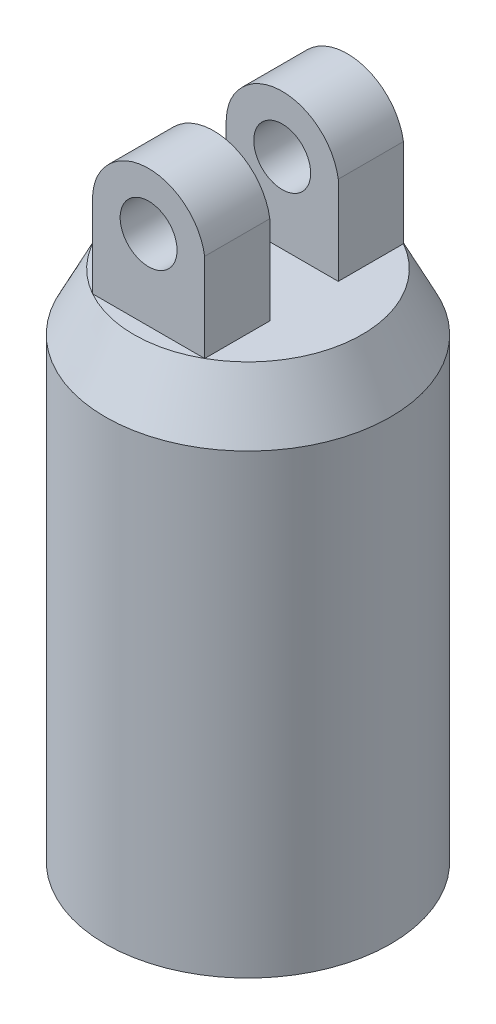
ISO-10303-21;
HEADER;
FILE_DESCRIPTION(('STEP AP214'),'2;1');
FILE_NAME('part.step','',(''),(''),'','','');
FILE_SCHEMA(('AUTOMOTIVE_DESIGN { 1 0 10303 214 1 1 1 1 }'));
ENDSEC;
DATA;
#1=APPLICATION_CONTEXT('core data for automotive mechanical design processes');
#2=APPLICATION_PROTOCOL_DEFINITION('international standard','automotive_design',2000,#1);
#3=PRODUCT_CONTEXT('',#1,'mechanical');
#4=PRODUCT('Part','Part','',(#3));
#5=PRODUCT_RELATED_PRODUCT_CATEGORY('part','',(#4));
#6=PRODUCT_DEFINITION_FORMATION('','',#4);
#7=PRODUCT_DEFINITION_CONTEXT('part definition',#1,'design');
#8=PRODUCT_DEFINITION('design','',#6,#7);
#9=PRODUCT_DEFINITION_SHAPE('','',#8);
#10=(LENGTH_UNIT() NAMED_UNIT(*) SI_UNIT(.MILLI.,.METRE.));
#11=(NAMED_UNIT(*) PLANE_ANGLE_UNIT() SI_UNIT($,.RADIAN.));
#12=(NAMED_UNIT(*) SI_UNIT($,.STERADIAN.) SOLID_ANGLE_UNIT());
#13=UNCERTAINTY_MEASURE_WITH_UNIT(LENGTH_MEASURE(1.E-05),#10,'distance_accuracy_value','');
#14=(GEOMETRIC_REPRESENTATION_CONTEXT(3) GLOBAL_UNCERTAINTY_ASSIGNED_CONTEXT((#13)) GLOBAL_UNIT_ASSIGNED_CONTEXT((#10,
#11,#12)) REPRESENTATION_CONTEXT('',''));
#15=CARTESIAN_POINT('',(0.,0.,0.));
#16=DIRECTION('',(0.,0.,1.));
#17=DIRECTION('',(1.,0.,0.));
#18=AXIS2_PLACEMENT_3D('',#15,#16,#17);
#19=CARTESIAN_POINT('',(4.91424576506021,60.,0.));
#20=DIRECTION('',(1.,0.,0.));
#21=DIRECTION('',(0.,0.,-1.));
#22=AXIS2_PLACEMENT_3D('',#19,#20,#21);
#23=PLANE('',#22);
#24=DIRECTION('',(0.,-1.,0.));
#25=VECTOR('',#24,1.);
#26=CARTESIAN_POINT('',(4.91424576506021,45.,3.));
#27=LINE('',#26,#25);
#28=CARTESIAN_POINT('',(4.91424576506021,52.7583297122865,3.));
#29=VERTEX_POINT('',#28);
#30=CARTESIAN_POINT('',(4.91424576506021,45.,3.));
#31=VERTEX_POINT('',#30);
#32=EDGE_CURVE('E125',#29,#31,#27,.T.);
#33=ORIENTED_EDGE('',*,*,#32,.F.);
#34=DIRECTION('',(0.,0.,1.));
#35=VECTOR('',#34,1.);
#36=CARTESIAN_POINT('',(4.91424576506021,52.7583297122865,-12.5));
#37=LINE('',#36,#35);
#38=CARTESIAN_POINT('',(4.91424576506021,52.7583297122865,8.7092013732941));
#39=VERTEX_POINT('',#38);
#40=EDGE_CURVE('E209',#29,#39,#37,.T.);
#41=ORIENTED_EDGE('',*,*,#40,.T.);
#42=DIRECTION('',(0.,-1.,0.));
#43=VECTOR('',#42,1.);
#44=CARTESIAN_POINT('',(4.91424576506021,60.,8.7092013732941));
#45=LINE('',#44,#43);
#46=CARTESIAN_POINT('',(4.91424576506021,45.,8.7092013732941));
#47=VERTEX_POINT('',#46);
#48=EDGE_CURVE('E154',#39,#47,#45,.T.);
#49=ORIENTED_EDGE('',*,*,#48,.T.);
#50=DIRECTION('',(0.,0.,1.));
#51=VECTOR('',#50,1.);
#52=CARTESIAN_POINT('',(4.91424576506021,45.,0.));
#53=LINE('',#52,#51);
#54=EDGE_CURVE('E141',#31,#47,#53,.T.);
#55=ORIENTED_EDGE('',*,*,#54,.F.);
#56=EDGE_LOOP('',(#33,#41,#49,#55));
#57=FACE_BOUND('',#56,.T.);
#58=ADVANCED_FACE('F37',(#57),#23,.T.);
#59=CARTESIAN_POINT('',(0.,52.1462305767102,-12.5));
#60=DIRECTION('',(0.,0.,1.));
#61=DIRECTION('',(1.,0.,0.));
#62=AXIS2_PLACEMENT_3D('',#59,#60,#61);
#63=CYLINDRICAL_SURFACE('',#62,4.91424576506021);
#64=CARTESIAN_POINT('',(0.,52.1462305767102,3.));
#65=DIRECTION('',(0.,0.,1.));
#66=DIRECTION('',(0.,-1.,0.));
#67=AXIS2_PLACEMENT_3D('',#64,#65,#66);
#68=CIRCLE('',#67,4.91424576506021);
#69=CARTESIAN_POINT('',(-4.91424576506021,52.1462305767102,3.));
#70=VERTEX_POINT('',#69);
#71=CARTESIAN_POINT('',(-4.53494149164419,54.0394070362026,3.));
#72=VERTEX_POINT('',#71);
#73=EDGE_CURVE('E219',#70,#72,#68,.F.);
#74=ORIENTED_EDGE('',*,*,#73,.F.);
#75=DIRECTION('',(0.,0.,1.));
#76=VECTOR('',#75,1.);
#77=CARTESIAN_POINT('',(-4.91424576506021,52.1462305767102,-12.5));
#78=LINE('',#77,#76);
#79=CARTESIAN_POINT('',(-4.91424576506021,52.1462305767102,8.7092013732941));
#80=VERTEX_POINT('',#79);
#81=EDGE_CURVE('E203',#70,#80,#78,.T.);
#82=ORIENTED_EDGE('',*,*,#81,.T.);
#83=CARTESIAN_POINT('',(0.,52.1462305767102,8.7092013732941));
#84=DIRECTION('',(0.,0.,1.));
#85=DIRECTION('',(1.,0.,0.));
#86=AXIS2_PLACEMENT_3D('',#83,#84,#85);
#87=CIRCLE('',#86,4.91424576506021);
#88=CARTESIAN_POINT('',(-4.53494149164419,54.0394070362026,8.7092013732941));
#89=VERTEX_POINT('',#88);
#90=EDGE_CURVE('E194',#89,#80,#87,.T.);
#91=ORIENTED_EDGE('',*,*,#90,.F.);
#92=DIRECTION('',(0.,0.,1.));
#93=VECTOR('',#92,1.);
#94=CARTESIAN_POINT('',(-4.53494149164419,54.0394070362026,-1.89539931335295));
#95=LINE('',#94,#93);
#96=EDGE_CURVE('E180',#89,#72,#95,.F.);
#97=ORIENTED_EDGE('',*,*,#96,.T.);
#98=EDGE_LOOP('',(#74,#82,#91,#97));
#99=FACE_BOUND('',#98,.T.);
#100=ADVANCED_FACE('F267',(#99),#63,.T.);
#101=CARTESIAN_POINT('',(-4.91424576506021,60.,0.));
#102=DIRECTION('',(1.,0.,0.));
#103=DIRECTION('',(0.,0.,-1.));
#104=AXIS2_PLACEMENT_3D('',#101,#102,#103);
#105=PLANE('',#104);
#106=ORIENTED_EDGE('',*,*,#81,.F.);
#107=DIRECTION('',(0.,-1.,0.));
#108=VECTOR('',#107,1.);
#109=CARTESIAN_POINT('',(-4.91424576506021,60.,3.));
#110=LINE('',#109,#108);
#111=CARTESIAN_POINT('',(-4.91424576506021,45.,3.));
#112=VERTEX_POINT('',#111);
#113=EDGE_CURVE('E216',#70,#112,#110,.T.);
#114=ORIENTED_EDGE('',*,*,#113,.T.);
#115=DIRECTION('',(0.,0.,1.));
#116=VECTOR('',#115,1.);
#117=CARTESIAN_POINT('',(-4.91424576506021,45.,0.));
#118=LINE('',#117,#116);
#119=CARTESIAN_POINT('',(-4.91424576506021,45.,8.7092013732941));
#120=VERTEX_POINT('',#119);
#121=EDGE_CURVE('E143',#112,#120,#118,.T.);
#122=ORIENTED_EDGE('',*,*,#121,.T.);
#123=DIRECTION('',(0.,-1.,0.));
#124=VECTOR('',#123,1.);
#125=CARTESIAN_POINT('',(-4.91424576506021,60.,8.7092013732941));
#126=LINE('',#125,#124);
#127=EDGE_CURVE('E157',#80,#120,#126,.T.);
#128=ORIENTED_EDGE('',*,*,#127,.F.);
#129=EDGE_LOOP('',(#106,#114,#122,#128));
#130=FACE_BOUND('',#129,.T.);
#131=ADVANCED_FACE('F243',(#130),#105,.F.);
#132=CARTESIAN_POINT('',(0.,52.,-12.5));
#133=DIRECTION('',(0.,0.,1.));
#134=DIRECTION('',(1.,0.,0.));
#135=AXIS2_PLACEMENT_3D('',#132,#133,#134);
#136=CYLINDRICAL_SURFACE('',#135,2.49298673079241);
#137=CARTESIAN_POINT('',(0.,52.,3.));
#138=DIRECTION('',(0.,0.,1.));
#139=DIRECTION('',(0.,-1.,0.));
#140=AXIS2_PLACEMENT_3D('',#137,#138,#139);
#141=CIRCLE('',#140,2.49298673079241);
#142=CARTESIAN_POINT('',(0.,49.5070132692076,3.));
#143=VERTEX_POINT('',#142);
#144=EDGE_CURVE('E213',#143,#143,#141,.F.);
#145=ORIENTED_EDGE('',*,*,#144,.T.);
#146=EDGE_LOOP('',(#145));
#147=FACE_BOUND('',#146,.T.);
#148=CARTESIAN_POINT('',(0.,52.,8.7092013732941));
#149=DIRECTION('',(0.,0.,1.));
#150=DIRECTION('',(1.,0.,0.));
#151=AXIS2_PLACEMENT_3D('',#148,#149,#150);
#152=CIRCLE('',#151,2.49298673079241);
#153=CARTESIAN_POINT('',(2.49298673079241,52.,8.7092013732941));
#154=VERTEX_POINT('',#153);
#155=EDGE_CURVE('E200',#154,#154,#152,.T.);
#156=ORIENTED_EDGE('',*,*,#155,.T.);
#157=EDGE_LOOP('',(#156));
#158=FACE_BOUND('',#157,.T.);
#159=ADVANCED_FACE('F271',(#147,#158),#136,.F.);
#160=CARTESIAN_POINT('',(0.,52.,-12.5));
#161=DIRECTION('',(0.,0.,1.));
#162=DIRECTION('',(1.,0.,0.));
#163=AXIS2_PLACEMENT_3D('',#160,#161,#162);
#164=CYLINDRICAL_SURFACE('',#163,4.97241142625474);
#165=CARTESIAN_POINT('',(0.,52.,3.));
#166=DIRECTION('',(0.,0.,1.));
#167=DIRECTION('',(0.,-1.,0.));
#168=AXIS2_PLACEMENT_3D('',#165,#166,#167);
#169=CIRCLE('',#168,4.97241142625474);
#170=EDGE_CURVE('E11',#72,#29,#169,.F.);
#171=ORIENTED_EDGE('',*,*,#170,.F.);
#172=ORIENTED_EDGE('',*,*,#96,.F.);
#173=CARTESIAN_POINT('',(0.,52.,8.7092013732941));
#174=DIRECTION('',(0.,0.,1.));
#175=DIRECTION('',(1.,0.,0.));
#176=AXIS2_PLACEMENT_3D('',#173,#174,#175);
#177=CIRCLE('',#176,4.97241142625474);
#178=EDGE_CURVE('E210',#39,#89,#177,.T.);
#179=ORIENTED_EDGE('',*,*,#178,.F.);
#180=ORIENTED_EDGE('',*,*,#40,.F.);
#181=EDGE_LOOP('',(#171,#172,#179,#180));
#182=FACE_BOUND('',#181,.T.);
#183=ADVANCED_FACE('F286',(#182),#164,.T.);
#184=CARTESIAN_POINT('',(0.,60.,-8.7092013732941));
#185=DIRECTION('',(0.,0.,-1.));
#186=DIRECTION('',(0.,1.,0.));
#187=AXIS2_PLACEMENT_3D('',#184,#185,#186);
#188=PLANE('',#187);
#189=CARTESIAN_POINT('',(0.,52.,-8.7092013732941));
#190=DIRECTION('',(0.,0.,-1.));
#191=DIRECTION('',(0.,1.,0.));
#192=AXIS2_PLACEMENT_3D('',#189,#190,#191);
#193=CIRCLE('',#192,2.49298673079241);
#194=CARTESIAN_POINT('',(0.,54.4929867307924,-8.7092013732941));
#195=VERTEX_POINT('',#194);
#196=EDGE_CURVE('E145',#195,#195,#193,.T.);
#197=ORIENTED_EDGE('',*,*,#196,.F.);
#198=EDGE_LOOP('',(#197));
#199=FACE_BOUND('',#198,.T.);
#200=CARTESIAN_POINT('',(0.,52.1462305767102,-8.7092013732941));
#201=DIRECTION('',(0.,0.,-1.));
#202=DIRECTION('',(0.,1.,0.));
#203=AXIS2_PLACEMENT_3D('',#200,#201,#202);
#204=CIRCLE('',#203,4.91424576506021);
#205=CARTESIAN_POINT('',(-4.91424576506021,52.1462305767102,-8.7092013732941));
#206=VERTEX_POINT('',#205);
#207=CARTESIAN_POINT('',(-4.53494149164419,54.0394070362026,-8.7092013732941));
#208=VERTEX_POINT('',#207);
#209=EDGE_CURVE('E197',#206,#208,#204,.T.);
#210=ORIENTED_EDGE('',*,*,#209,.T.);
#211=CARTESIAN_POINT('',(0.,52.,-8.7092013732941));
#212=DIRECTION('',(0.,0.,-1.));
#213=DIRECTION('',(0.,1.,0.));
#214=AXIS2_PLACEMENT_3D('',#211,#212,#213);
#215=CIRCLE('',#214,4.97241142625474);
#216=CARTESIAN_POINT('',(4.91424576506021,52.7583297122865,-8.7092013732941));
#217=VERTEX_POINT('',#216);
#218=EDGE_CURVE('E191',#208,#217,#215,.T.);
#219=ORIENTED_EDGE('',*,*,#218,.T.);
#220=DIRECTION('',(0.,-1.,0.));
#221=VECTOR('',#220,1.);
#222=CARTESIAN_POINT('',(4.91424576506021,60.,-8.7092013732941));
#223=LINE('',#222,#221);
#224=CARTESIAN_POINT('',(4.91424576506021,45.,-8.7092013732941));
#225=VERTEX_POINT('',#224);
#226=EDGE_CURVE('E163',#217,#225,#223,.T.);
#227=ORIENTED_EDGE('',*,*,#226,.T.);
#228=DIRECTION('',(1.,0.,0.));
#229=VECTOR('',#228,1.);
#230=CARTESIAN_POINT('',(0.,45.,-8.7092013732941));
#231=LINE('',#230,#229);
#232=CARTESIAN_POINT('',(-4.91424576506021,45.,-8.7092013732941));
#233=VERTEX_POINT('',#232);
#234=EDGE_CURVE('E140',#233,#225,#231,.T.);
#235=ORIENTED_EDGE('',*,*,#234,.F.);
#236=DIRECTION('',(0.,-1.,0.));
#237=VECTOR('',#236,1.);
#238=CARTESIAN_POINT('',(-4.91424576506021,60.,-8.7092013732941));
#239=LINE('',#238,#237);
#240=EDGE_CURVE('E160',#206,#233,#239,.T.);
#241=ORIENTED_EDGE('',*,*,#240,.F.);
#242=EDGE_LOOP('',(#210,#219,#227,#235,#241));
#243=FACE_BOUND('',#242,.T.);
#244=ADVANCED_FACE('F198',(#199,#243),#188,.T.);
#245=CARTESIAN_POINT('',(0.,60.,8.7092013732941));
#246=DIRECTION('',(0.,0.,-1.));
#247=DIRECTION('',(0.,1.,0.));
#248=AXIS2_PLACEMENT_3D('',#245,#246,#247);
#249=PLANE('',#248);
#250=ORIENTED_EDGE('',*,*,#155,.F.);
#251=EDGE_LOOP('',(#250));
#252=FACE_BOUND('',#251,.T.);
#253=ORIENTED_EDGE('',*,*,#178,.T.);
#254=ORIENTED_EDGE('',*,*,#90,.T.);
#255=ORIENTED_EDGE('',*,*,#127,.T.);
#256=DIRECTION('',(1.,0.,0.));
#257=VECTOR('',#256,1.);
#258=CARTESIAN_POINT('',(0.,45.,8.7092013732941));
#259=LINE('',#258,#257);
#260=EDGE_CURVE('E151',#120,#47,#259,.T.);
#261=ORIENTED_EDGE('',*,*,#260,.T.);
#262=ORIENTED_EDGE('',*,*,#48,.F.);
#263=EDGE_LOOP('',(#253,#254,#255,#261,#262));
#264=FACE_BOUND('',#263,.T.);
#265=ADVANCED_FACE('F246',(#252,#264),#249,.F.);
#266=DIRECTION('',(0.,1.,0.));
#267=VECTOR('',#266,1.);
#268=CARTESIAN_POINT('',(4.91424576506021,45.,-3.));
#269=LINE('',#268,#267);
#270=CARTESIAN_POINT('',(4.91424576506021,45.,-3.));
#271=VERTEX_POINT('',#270);
#272=CARTESIAN_POINT('',(4.91424576506021,52.7583297122865,-3.));
#273=VERTEX_POINT('',#272);
#274=EDGE_CURVE('E52',#271,#273,#269,.T.);
#275=ORIENTED_EDGE('',*,*,#274,.F.);
#276=EDGE_CURVE('E132',#225,#271,#53,.T.);
#277=ORIENTED_EDGE('',*,*,#276,.F.);
#278=ORIENTED_EDGE('',*,*,#226,.F.);
#279=EDGE_CURVE('E134',#217,#273,#37,.T.);
#280=ORIENTED_EDGE('',*,*,#279,.T.);
#281=EDGE_LOOP('',(#275,#277,#278,#280));
#282=FACE_BOUND('',#281,.T.);
#283=ADVANCED_FACE('F130',(#282),#23,.T.);
#284=CARTESIAN_POINT('',(0.,52.1462305767102,-3.));
#285=DIRECTION('',(0.,0.,-1.));
#286=DIRECTION('',(0.,1.,0.));
#287=AXIS2_PLACEMENT_3D('',#284,#285,#286);
#288=CIRCLE('',#287,4.91424576506021);
#289=CARTESIAN_POINT('',(-4.53494149164419,54.0394070362026,-3.));
#290=VERTEX_POINT('',#289);
#291=CARTESIAN_POINT('',(-4.91424576506021,52.1462305767102,-3.));
#292=VERTEX_POINT('',#291);
#293=EDGE_CURVE('E182',#290,#292,#288,.F.);
#294=ORIENTED_EDGE('',*,*,#293,.F.);
#295=EDGE_CURVE('E60',#290,#208,#95,.F.);
#296=ORIENTED_EDGE('',*,*,#295,.T.);
#297=ORIENTED_EDGE('',*,*,#209,.F.);
#298=EDGE_CURVE('E187',#206,#292,#78,.T.);
#299=ORIENTED_EDGE('',*,*,#298,.T.);
#300=EDGE_LOOP('',(#294,#296,#297,#299));
#301=FACE_BOUND('',#300,.T.);
#302=ADVANCED_FACE('F185',(#301),#63,.T.);
#303=CARTESIAN_POINT('',(-4.91424576506021,45.,-3.));
#304=VERTEX_POINT('',#303);
#305=EDGE_CURVE('E149',#233,#304,#118,.T.);
#306=ORIENTED_EDGE('',*,*,#305,.T.);
#307=DIRECTION('',(0.,1.,0.));
#308=VECTOR('',#307,1.);
#309=CARTESIAN_POINT('',(-4.91424576506021,60.,-3.));
#310=LINE('',#309,#308);
#311=EDGE_CURVE('E119',#304,#292,#310,.T.);
#312=ORIENTED_EDGE('',*,*,#311,.T.);
#313=ORIENTED_EDGE('',*,*,#298,.F.);
#314=ORIENTED_EDGE('',*,*,#240,.T.);
#315=EDGE_LOOP('',(#306,#312,#313,#314));
#316=FACE_BOUND('',#315,.T.);
#317=ADVANCED_FACE('F258',(#316),#105,.F.);
#318=CARTESIAN_POINT('',(0.,45.,10.));
#319=DIRECTION('',(0.,-1.,0.));
#320=DIRECTION('',(0.,0.,-1.));
#321=AXIS2_PLACEMENT_3D('',#318,#319,#320);
#322=PLANE('',#321);
#323=ORIENTED_EDGE('',*,*,#260,.F.);
#324=CARTESIAN_POINT('',(0.,45.,0.));
#325=DIRECTION('',(0.,-1.,0.));
#326=DIRECTION('',(0.,0.,-1.));
#327=AXIS2_PLACEMENT_3D('',#324,#325,#326);
#328=CIRCLE('',#327,10.);
#329=EDGE_CURVE('E168',#47,#120,#328,.T.);
#330=ORIENTED_EDGE('',*,*,#329,.F.);
#331=EDGE_LOOP('',(#323,#330));
#332=FACE_BOUND('',#331,.T.);
#333=ADVANCED_FACE('F250',(#332),#322,.F.);
#334=EDGE_CURVE('E139',#225,#47,#328,.T.);
#335=ORIENTED_EDGE('',*,*,#334,.F.);
#336=ORIENTED_EDGE('',*,*,#276,.T.);
#337=DIRECTION('',(1.,0.,0.));
#338=VECTOR('',#337,1.);
#339=CARTESIAN_POINT('',(-10.0857542349398,45.,-3.));
#340=LINE('',#339,#338);
#341=EDGE_CURVE('E115',#304,#271,#340,.T.);
#342=ORIENTED_EDGE('',*,*,#341,.F.);
#343=ORIENTED_EDGE('',*,*,#305,.F.);
#344=EDGE_CURVE('E238',#120,#233,#328,.T.);
#345=ORIENTED_EDGE('',*,*,#344,.F.);
#346=ORIENTED_EDGE('',*,*,#121,.F.);
#347=DIRECTION('',(1.,0.,0.));
#348=VECTOR('',#347,1.);
#349=CARTESIAN_POINT('',(-10.0857542349398,45.,3.));
#350=LINE('',#349,#348);
#351=EDGE_CURVE('E124',#112,#31,#350,.T.);
#352=ORIENTED_EDGE('',*,*,#351,.T.);
#353=ORIENTED_EDGE('',*,*,#54,.T.);
#354=EDGE_LOOP('',(#335,#336,#342,#343,#345,#346,#352,#353));
#355=FACE_BOUND('',#354,.T.);
#356=ADVANCED_FACE('F137',(#355),#322,.F.);
#357=CARTESIAN_POINT('',(0.,40.,0.));
#358=DIRECTION('',(0.,-1.,0.));
#359=DIRECTION('',(0.,0.,-1.));
#360=AXIS2_PLACEMENT_3D('',#357,#358,#359);
#361=CYLINDRICAL_SURFACE('',#360,5.);
#362=CARTESIAN_POINT('',(0.,0.,0.));
#363=DIRECTION('',(0.,1.,0.));
#364=DIRECTION('',(0.,0.,1.));
#365=AXIS2_PLACEMENT_3D('',#362,#363,#364);
#366=CIRCLE('',#365,5.);
#367=CARTESIAN_POINT('',(0.,0.,5.));
#368=VERTEX_POINT('',#367);
#369=EDGE_CURVE('E169',#368,#368,#366,.T.);
#370=ORIENTED_EDGE('',*,*,#369,.F.);
#371=EDGE_LOOP('',(#370));
#372=FACE_BOUND('',#371,.T.);
#373=CARTESIAN_POINT('',(0.,39.9999479884807,0.));
#374=DIRECTION('',(0.,1.,0.));
#375=DIRECTION('',(0.,0.,1.));
#376=AXIS2_PLACEMENT_3D('',#373,#374,#375);
#377=CIRCLE('',#376,5.);
#378=CARTESIAN_POINT('',(0.,39.9999479884807,5.));
#379=VERTEX_POINT('',#378);
#380=EDGE_CURVE('E167',#379,#379,#377,.T.);
#381=ORIENTED_EDGE('',*,*,#380,.T.);
#382=EDGE_LOOP('',(#381));
#383=FACE_BOUND('',#382,.T.);
#384=ADVANCED_FACE('F322',(#372,#383),#361,.F.);
#385=CARTESIAN_POINT('',(0.,0.,0.));
#386=DIRECTION('',(0.,1.,0.));
#387=DIRECTION('',(0.,0.,1.));
#388=AXIS2_PLACEMENT_3D('',#385,#386,#387);
#389=PLANE('',#388);
#390=CARTESIAN_POINT('',(0.,0.,0.));
#391=DIRECTION('',(0.,1.,0.));
#392=DIRECTION('',(0.,0.,1.));
#393=AXIS2_PLACEMENT_3D('',#390,#391,#392);
#394=CIRCLE('',#393,12.5);
#395=CARTESIAN_POINT('',(0.,0.,12.5));
#396=VERTEX_POINT('',#395);
#397=EDGE_CURVE('E172',#396,#396,#394,.T.);
#398=ORIENTED_EDGE('',*,*,#397,.F.);
#399=EDGE_LOOP('',(#398));
#400=FACE_BOUND('',#399,.T.);
#401=ORIENTED_EDGE('',*,*,#369,.T.);
#402=EDGE_LOOP('',(#401));
#403=FACE_BOUND('',#402,.T.);
#404=ADVANCED_FACE('F418',(#400,#403),#389,.F.);
#405=CARTESIAN_POINT('',(0.,40.,0.));
#406=DIRECTION('',(0.,-1.,0.));
#407=DIRECTION('',(0.,0.,-1.));
#408=AXIS2_PLACEMENT_3D('',#405,#406,#407);
#409=CYLINDRICAL_SURFACE('',#408,12.5);
#410=CARTESIAN_POINT('',(0.,40.,0.));
#411=DIRECTION('',(0.,1.,0.));
#412=DIRECTION('',(0.,0.,1.));
#413=AXIS2_PLACEMENT_3D('',#410,#411,#412);
#414=CIRCLE('',#413,12.5);
#415=CARTESIAN_POINT('',(0.,40.,12.5));
#416=VERTEX_POINT('',#415);
#417=EDGE_CURVE('E173',#416,#416,#414,.T.);
#418=ORIENTED_EDGE('',*,*,#417,.F.);
#419=EDGE_LOOP('',(#418));
#420=FACE_BOUND('',#419,.T.);
#421=ORIENTED_EDGE('',*,*,#397,.T.);
#422=EDGE_LOOP('',(#421));
#423=FACE_BOUND('',#422,.T.);
#424=ADVANCED_FACE('F39',(#420,#423),#409,.T.);
#425=CARTESIAN_POINT('',(0.,40.,0.));
#426=DIRECTION('',(0.,1.,0.));
#427=DIRECTION('',(0.,0.,1.));
#428=AXIS2_PLACEMENT_3D('',#425,#426,#427);
#429=CONICAL_SURFACE('',#428,12.5,1.57078939192566);
#430=ORIENTED_EDGE('',*,*,#380,.F.);
#431=EDGE_LOOP('',(#430));
#432=FACE_BOUND('',#431,.T.);
#433=CARTESIAN_POINT('',(0.,39.9999133141346,0.));
#434=VERTEX_POINT('',#433);
#435=VERTEX_LOOP('',#434);
#436=FACE_BOUND('',#435,.T.);
#437=ADVANCED_FACE('F338',(#432,#436),#429,.T.);
#438=CARTESIAN_POINT('',(0.,45.,0.));
#439=DIRECTION('',(0.,-1.,0.));
#440=DIRECTION('',(0.,0.,-1.));
#441=AXIS2_PLACEMENT_3D('',#438,#439,#440);
#442=CONICAL_SURFACE('',#441,10.,0.463647609000806);
#443=ORIENTED_EDGE('',*,*,#417,.T.);
#444=EDGE_LOOP('',(#443));
#445=FACE_BOUND('',#444,.T.);
#446=ORIENTED_EDGE('',*,*,#334,.T.);
#447=ORIENTED_EDGE('',*,*,#329,.T.);
#448=ORIENTED_EDGE('',*,*,#344,.T.);
#449=EDGE_CURVE('E165',#233,#225,#328,.T.);
#450=ORIENTED_EDGE('',*,*,#449,.T.);
#451=EDGE_LOOP('',(#446,#447,#448,#450));
#452=FACE_BOUND('',#451,.T.);
#453=ADVANCED_FACE('F253',(#445,#452),#442,.T.);
#454=ORIENTED_EDGE('',*,*,#449,.F.);
#455=ORIENTED_EDGE('',*,*,#234,.T.);
#456=EDGE_LOOP('',(#454,#455));
#457=FACE_BOUND('',#456,.T.);
#458=ADVANCED_FACE('F256',(#457),#322,.F.);
#459=CARTESIAN_POINT('',(0.,52.,-3.));
#460=DIRECTION('',(0.,0.,-1.));
#461=DIRECTION('',(0.,1.,0.));
#462=AXIS2_PLACEMENT_3D('',#459,#460,#461);
#463=CIRCLE('',#462,2.49298673079241);
#464=CARTESIAN_POINT('',(0.,54.4929867307924,-3.));
#465=VERTEX_POINT('',#464);
#466=EDGE_CURVE('E221',#465,#465,#463,.F.);
#467=ORIENTED_EDGE('',*,*,#466,.T.);
#468=EDGE_LOOP('',(#467));
#469=FACE_BOUND('',#468,.T.);
#470=ORIENTED_EDGE('',*,*,#196,.T.);
#471=EDGE_LOOP('',(#470));
#472=FACE_BOUND('',#471,.T.);
#473=ADVANCED_FACE('F290',(#469,#472),#136,.F.);
#474=CARTESIAN_POINT('',(0.,52.,-3.));
#475=DIRECTION('',(0.,0.,-1.));
#476=DIRECTION('',(0.,1.,0.));
#477=AXIS2_PLACEMENT_3D('',#474,#475,#476);
#478=CIRCLE('',#477,4.97241142625474);
#479=EDGE_CURVE('E45',#273,#290,#478,.F.);
#480=ORIENTED_EDGE('',*,*,#479,.F.);
#481=ORIENTED_EDGE('',*,*,#279,.F.);
#482=ORIENTED_EDGE('',*,*,#218,.F.);
#483=ORIENTED_EDGE('',*,*,#295,.F.);
#484=EDGE_LOOP('',(#480,#481,#482,#483));
#485=FACE_BOUND('',#484,.T.);
#486=ADVANCED_FACE('F189',(#485),#164,.T.);
#487=CARTESIAN_POINT('',(-10.0857542349398,45.,3.));
#488=DIRECTION('',(0.,0.,1.));
#489=DIRECTION('',(0.,-1.,0.));
#490=AXIS2_PLACEMENT_3D('',#487,#488,#489);
#491=PLANE('',#490);
#492=ORIENTED_EDGE('',*,*,#73,.T.);
#493=ORIENTED_EDGE('',*,*,#170,.T.);
#494=ORIENTED_EDGE('',*,*,#32,.T.);
#495=ORIENTED_EDGE('',*,*,#351,.F.);
#496=ORIENTED_EDGE('',*,*,#113,.F.);
#497=EDGE_LOOP('',(#492,#493,#494,#495,#496));
#498=FACE_BOUND('',#497,.T.);
#499=ORIENTED_EDGE('',*,*,#144,.F.);
#500=EDGE_LOOP('',(#499));
#501=FACE_BOUND('',#500,.T.);
#502=ADVANCED_FACE('F230',(#498,#501),#491,.F.);
#503=CARTESIAN_POINT('',(-10.0857542349398,45.,-3.));
#504=DIRECTION('',(0.,0.,-1.));
#505=DIRECTION('',(0.,1.,0.));
#506=AXIS2_PLACEMENT_3D('',#503,#504,#505);
#507=PLANE('',#506);
#508=ORIENTED_EDGE('',*,*,#341,.T.);
#509=ORIENTED_EDGE('',*,*,#274,.T.);
#510=ORIENTED_EDGE('',*,*,#479,.T.);
#511=ORIENTED_EDGE('',*,*,#293,.T.);
#512=ORIENTED_EDGE('',*,*,#311,.F.);
#513=EDGE_LOOP('',(#508,#509,#510,#511,#512));
#514=FACE_BOUND('',#513,.T.);
#515=ORIENTED_EDGE('',*,*,#466,.F.);
#516=EDGE_LOOP('',(#515));
#517=FACE_BOUND('',#516,.T.);
#518=ADVANCED_FACE('F116',(#514,#517),#507,.F.);
#519=CLOSED_SHELL('',(#58,#100,#131,#159,#183,#244,#265,#283,#302,#317,#333,#356,#384,#404,#424,
#437,#453,#458,#473,#486,#502,#518));
#520=MANIFOLD_SOLID_BREP('B2',#519);
#521=ADVANCED_BREP_SHAPE_REPRESENTATION('',(#18,#520),#14);
#522=SHAPE_DEFINITION_REPRESENTATION(#9,#521);
ENDSEC;
END-ISO-10303-21;
